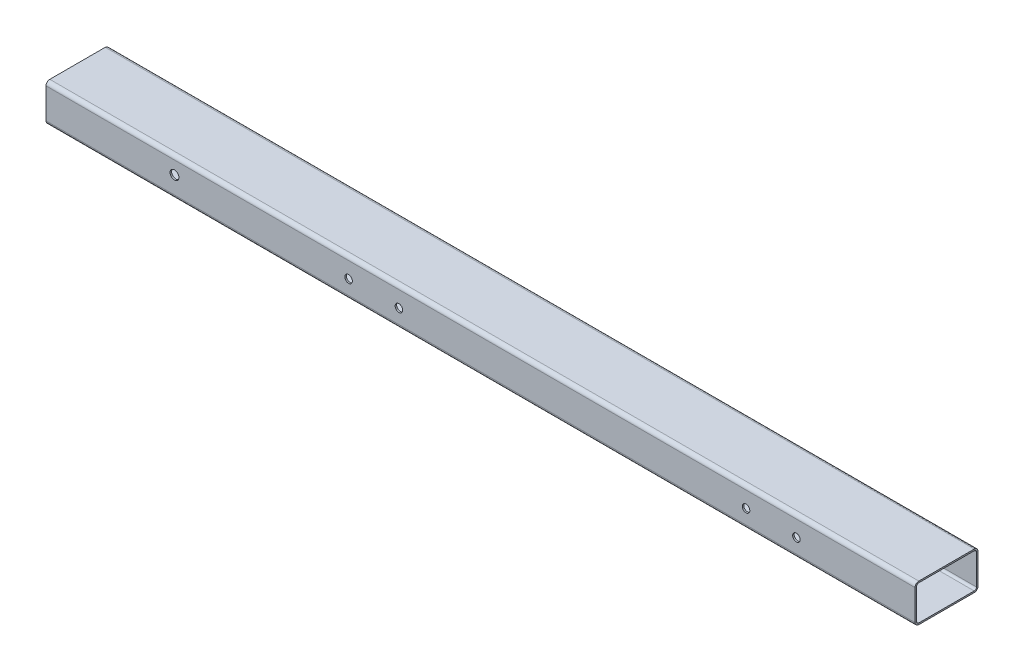
ISO-10303-21;
HEADER;
FILE_DESCRIPTION(('STEP AP214'),'2;1');
FILE_NAME('part.step','',(''),(''),'','','');
FILE_SCHEMA(('AUTOMOTIVE_DESIGN { 1 0 10303 214 1 1 1 1 }'));
ENDSEC;
DATA;
#1=APPLICATION_CONTEXT('core data for automotive mechanical design processes');
#2=APPLICATION_PROTOCOL_DEFINITION('international standard','automotive_design',2000,#1);
#3=PRODUCT_CONTEXT('',#1,'mechanical');
#4=PRODUCT('Part','Part','',(#3));
#5=PRODUCT_RELATED_PRODUCT_CATEGORY('part','',(#4));
#6=PRODUCT_DEFINITION_FORMATION('','',#4);
#7=PRODUCT_DEFINITION_CONTEXT('part definition',#1,'design');
#8=PRODUCT_DEFINITION('design','',#6,#7);
#9=PRODUCT_DEFINITION_SHAPE('','',#8);
#10=(LENGTH_UNIT() NAMED_UNIT(*) SI_UNIT(.MILLI.,.METRE.));
#11=(NAMED_UNIT(*) PLANE_ANGLE_UNIT() SI_UNIT($,.RADIAN.));
#12=(NAMED_UNIT(*) SI_UNIT($,.STERADIAN.) SOLID_ANGLE_UNIT());
#13=UNCERTAINTY_MEASURE_WITH_UNIT(LENGTH_MEASURE(1.E-05),#10,'distance_accuracy_value','');
#14=(GEOMETRIC_REPRESENTATION_CONTEXT(3) GLOBAL_UNCERTAINTY_ASSIGNED_CONTEXT((#13)) GLOBAL_UNIT_ASSIGNED_CONTEXT((#10,
#11,#12)) REPRESENTATION_CONTEXT('',''));
#15=CARTESIAN_POINT('',(0.,0.,0.));
#16=DIRECTION('',(0.,0.,1.));
#17=DIRECTION('',(1.,0.,0.));
#18=AXIS2_PLACEMENT_3D('',#15,#16,#17);
#19=CARTESIAN_POINT('',(689.8,12.,22.));
#20=DIRECTION('',(-1.,0.,0.));
#21=DIRECTION('',(0.,0.,1.));
#22=AXIS2_PLACEMENT_3D('',#19,#20,#21);
#23=CYLINDRICAL_SURFACE('',#22,3.);
#24=CARTESIAN_POINT('',(0.,12.,22.));
#25=DIRECTION('',(1.,0.,0.));
#26=DIRECTION('',(0.,0.,-1.));
#27=AXIS2_PLACEMENT_3D('',#24,#25,#26);
#28=CIRCLE('',#27,3.);
#29=CARTESIAN_POINT('',(0.,15.,22.));
#30=VERTEX_POINT('',#29);
#31=CARTESIAN_POINT('',(0.,12.,25.));
#32=VERTEX_POINT('',#31);
#33=EDGE_CURVE('E240',#30,#32,#28,.T.);
#34=ORIENTED_EDGE('',*,*,#33,.T.);
#35=DIRECTION('',(-1.,0.,0.));
#36=VECTOR('',#35,1.);
#37=CARTESIAN_POINT('',(689.8,12.,25.));
#38=LINE('',#37,#36);
#39=CARTESIAN_POINT('',(689.8,12.,25.));
#40=VERTEX_POINT('',#39);
#41=EDGE_CURVE('E12',#40,#32,#38,.T.);
#42=ORIENTED_EDGE('',*,*,#41,.F.);
#43=CARTESIAN_POINT('',(689.8,12.,22.));
#44=DIRECTION('',(1.,0.,0.));
#45=DIRECTION('',(0.,0.,-1.));
#46=AXIS2_PLACEMENT_3D('',#43,#44,#45);
#47=CIRCLE('',#46,3.);
#48=CARTESIAN_POINT('',(689.8,15.,22.));
#49=VERTEX_POINT('',#48);
#50=EDGE_CURVE('E328',#49,#40,#47,.T.);
#51=ORIENTED_EDGE('',*,*,#50,.F.);
#52=DIRECTION('',(-1.,0.,0.));
#53=VECTOR('',#52,1.);
#54=CARTESIAN_POINT('',(689.8,15.,22.));
#55=LINE('',#54,#53);
#56=EDGE_CURVE('E255',#49,#30,#55,.T.);
#57=ORIENTED_EDGE('',*,*,#56,.T.);
#58=EDGE_LOOP('',(#34,#42,#51,#57));
#59=FACE_BOUND('',#58,.T.);
#60=ADVANCED_FACE('F66',(#59),#23,.T.);
#61=CARTESIAN_POINT('',(689.8,12.,25.));
#62=DIRECTION('',(0.,0.,-1.));
#63=DIRECTION('',(-1.,0.,0.));
#64=AXIS2_PLACEMENT_3D('',#61,#62,#63);
#65=PLANE('',#64);
#66=CARTESIAN_POINT('',(102.,1.76941009464096,25.));
#67=DIRECTION('',(0.,0.,1.));
#68=DIRECTION('',(1.,0.,0.));
#69=AXIS2_PLACEMENT_3D('',#66,#67,#68);
#70=CIRCLE('',#69,3.50000000000001);
#71=CARTESIAN_POINT('',(105.5,1.76941009464096,25.));
#72=VERTEX_POINT('',#71);
#73=EDGE_CURVE('E471',#72,#72,#70,.T.);
#74=ORIENTED_EDGE('',*,*,#73,.F.);
#75=EDGE_LOOP('',(#74));
#76=FACE_BOUND('',#75,.T.);
#77=CARTESIAN_POINT('',(240.162500000002,-0.65302720036876,25.));
#78=DIRECTION('',(0.,0.,1.));
#79=DIRECTION('',(1.,0.,0.));
#80=AXIS2_PLACEMENT_3D('',#77,#78,#79);
#81=CIRCLE('',#80,2.99999999999999);
#82=CARTESIAN_POINT('',(243.162500000002,-0.65302720036876,25.));
#83=VERTEX_POINT('',#82);
#84=EDGE_CURVE('E484',#83,#83,#81,.T.);
#85=ORIENTED_EDGE('',*,*,#84,.F.);
#86=EDGE_LOOP('',(#85));
#87=FACE_BOUND('',#86,.T.);
#88=CARTESIAN_POINT('',(595.662500000002,-0.653027200368528,25.));
#89=DIRECTION('',(0.,0.,1.));
#90=DIRECTION('',(1.,0.,0.));
#91=AXIS2_PLACEMENT_3D('',#88,#89,#90);
#92=CIRCLE('',#91,3.00000000000005);
#93=CARTESIAN_POINT('',(598.662500000002,-0.653027200368528,25.));
#94=VERTEX_POINT('',#93);
#95=EDGE_CURVE('E491',#94,#94,#92,.T.);
#96=ORIENTED_EDGE('',*,*,#95,.F.);
#97=EDGE_LOOP('',(#96));
#98=FACE_BOUND('',#97,.T.);
#99=CARTESIAN_POINT('',(555.662500000002,-0.653027200368538,25.));
#100=DIRECTION('',(0.,0.,1.));
#101=DIRECTION('',(1.,0.,0.));
#102=AXIS2_PLACEMENT_3D('',#99,#100,#101);
#103=CIRCLE('',#102,3.00000000000005);
#104=CARTESIAN_POINT('',(558.662500000002,-0.653027200368538,25.));
#105=VERTEX_POINT('',#104);
#106=EDGE_CURVE('E478',#105,#105,#103,.T.);
#107=ORIENTED_EDGE('',*,*,#106,.F.);
#108=EDGE_LOOP('',(#107));
#109=FACE_BOUND('',#108,.T.);
#110=CARTESIAN_POINT('',(280.162500000002,-0.65302720036875,25.));
#111=DIRECTION('',(0.,0.,1.));
#112=DIRECTION('',(1.,0.,0.));
#113=AXIS2_PLACEMENT_3D('',#110,#111,#112);
#114=CIRCLE('',#113,2.99999999999999);
#115=CARTESIAN_POINT('',(283.162500000002,-0.65302720036875,25.));
#116=VERTEX_POINT('',#115);
#117=EDGE_CURVE('E487',#116,#116,#114,.T.);
#118=ORIENTED_EDGE('',*,*,#117,.F.);
#119=EDGE_LOOP('',(#118));
#120=FACE_BOUND('',#119,.T.);
#121=DIRECTION('',(0.,-1.,0.));
#122=VECTOR('',#121,1.);
#123=CARTESIAN_POINT('',(0.,12.,25.));
#124=LINE('',#123,#122);
#125=CARTESIAN_POINT('',(0.,-12.,25.));
#126=VERTEX_POINT('',#125);
#127=EDGE_CURVE('E243',#32,#126,#124,.T.);
#128=ORIENTED_EDGE('',*,*,#127,.T.);
#129=DIRECTION('',(-1.,0.,0.));
#130=VECTOR('',#129,1.);
#131=CARTESIAN_POINT('',(689.8,-12.,25.));
#132=LINE('',#131,#130);
#133=CARTESIAN_POINT('',(689.8,-12.,25.));
#134=VERTEX_POINT('',#133);
#135=EDGE_CURVE('E76',#134,#126,#132,.T.);
#136=ORIENTED_EDGE('',*,*,#135,.F.);
#137=DIRECTION('',(0.,-1.,0.));
#138=VECTOR('',#137,1.);
#139=CARTESIAN_POINT('',(689.8,12.,25.));
#140=LINE('',#139,#138);
#141=EDGE_CURVE('E330',#40,#134,#140,.T.);
#142=ORIENTED_EDGE('',*,*,#141,.F.);
#143=ORIENTED_EDGE('',*,*,#41,.T.);
#144=EDGE_LOOP('',(#128,#136,#142,#143));
#145=FACE_BOUND('',#144,.T.);
#146=ADVANCED_FACE('F368',(#76,#87,#98,#109,#120,#145),#65,.F.);
#147=CARTESIAN_POINT('',(689.8,-12.,22.));
#148=DIRECTION('',(-1.,0.,0.));
#149=DIRECTION('',(0.,0.,1.));
#150=AXIS2_PLACEMENT_3D('',#147,#148,#149);
#151=CYLINDRICAL_SURFACE('',#150,3.);
#152=CARTESIAN_POINT('',(0.,-12.,22.));
#153=DIRECTION('',(1.,0.,0.));
#154=DIRECTION('',(0.,0.,-1.));
#155=AXIS2_PLACEMENT_3D('',#152,#153,#154);
#156=CIRCLE('',#155,3.);
#157=CARTESIAN_POINT('',(0.,-15.,22.));
#158=VERTEX_POINT('',#157);
#159=EDGE_CURVE('E245',#126,#158,#156,.T.);
#160=ORIENTED_EDGE('',*,*,#159,.T.);
#161=DIRECTION('',(-1.,0.,0.));
#162=VECTOR('',#161,1.);
#163=CARTESIAN_POINT('',(689.8,-15.,22.));
#164=LINE('',#163,#162);
#165=CARTESIAN_POINT('',(689.8,-15.,22.));
#166=VERTEX_POINT('',#165);
#167=EDGE_CURVE('E262',#166,#158,#164,.T.);
#168=ORIENTED_EDGE('',*,*,#167,.F.);
#169=CARTESIAN_POINT('',(689.8,-12.,22.));
#170=DIRECTION('',(1.,0.,0.));
#171=DIRECTION('',(0.,0.,-1.));
#172=AXIS2_PLACEMENT_3D('',#169,#170,#171);
#173=CIRCLE('',#172,3.);
#174=EDGE_CURVE('E332',#134,#166,#173,.T.);
#175=ORIENTED_EDGE('',*,*,#174,.F.);
#176=ORIENTED_EDGE('',*,*,#135,.T.);
#177=EDGE_LOOP('',(#160,#168,#175,#176));
#178=FACE_BOUND('',#177,.T.);
#179=ADVANCED_FACE('F373',(#178),#151,.T.);
#180=CARTESIAN_POINT('',(689.8,-15.,-22.));
#181=DIRECTION('',(0.,1.,0.));
#182=DIRECTION('',(0.,0.,1.));
#183=AXIS2_PLACEMENT_3D('',#180,#181,#182);
#184=PLANE('',#183);
#185=DIRECTION('',(0.,0.,-1.));
#186=VECTOR('',#185,1.);
#187=CARTESIAN_POINT('',(0.,-15.,-22.));
#188=LINE('',#187,#186);
#189=CARTESIAN_POINT('',(0.,-15.,-22.));
#190=VERTEX_POINT('',#189);
#191=EDGE_CURVE('E247',#158,#190,#188,.T.);
#192=ORIENTED_EDGE('',*,*,#191,.T.);
#193=DIRECTION('',(-1.,0.,0.));
#194=VECTOR('',#193,1.);
#195=CARTESIAN_POINT('',(689.8,-15.,-22.));
#196=LINE('',#195,#194);
#197=CARTESIAN_POINT('',(689.8,-15.,-22.));
#198=VERTEX_POINT('',#197);
#199=EDGE_CURVE('E259',#198,#190,#196,.T.);
#200=ORIENTED_EDGE('',*,*,#199,.F.);
#201=DIRECTION('',(0.,0.,-1.));
#202=VECTOR('',#201,1.);
#203=CARTESIAN_POINT('',(689.8,-15.,-22.));
#204=LINE('',#203,#202);
#205=EDGE_CURVE('E334',#166,#198,#204,.T.);
#206=ORIENTED_EDGE('',*,*,#205,.F.);
#207=ORIENTED_EDGE('',*,*,#167,.T.);
#208=EDGE_LOOP('',(#192,#200,#206,#207));
#209=FACE_BOUND('',#208,.T.);
#210=ADVANCED_FACE('F340',(#209),#184,.F.);
#211=CARTESIAN_POINT('',(689.8,-12.,-22.));
#212=DIRECTION('',(-1.,0.,0.));
#213=DIRECTION('',(0.,0.,1.));
#214=AXIS2_PLACEMENT_3D('',#211,#212,#213);
#215=CYLINDRICAL_SURFACE('',#214,3.);
#216=CARTESIAN_POINT('',(0.,-12.,-22.));
#217=DIRECTION('',(1.,0.,0.));
#218=DIRECTION('',(0.,0.,-1.));
#219=AXIS2_PLACEMENT_3D('',#216,#217,#218);
#220=CIRCLE('',#219,3.);
#221=CARTESIAN_POINT('',(0.,-12.,-25.));
#222=VERTEX_POINT('',#221);
#223=EDGE_CURVE('E249',#190,#222,#220,.T.);
#224=ORIENTED_EDGE('',*,*,#223,.T.);
#225=DIRECTION('',(-1.,0.,0.));
#226=VECTOR('',#225,1.);
#227=CARTESIAN_POINT('',(689.8,-12.,-25.));
#228=LINE('',#227,#226);
#229=CARTESIAN_POINT('',(689.8,-12.,-25.));
#230=VERTEX_POINT('',#229);
#231=EDGE_CURVE('E206',#230,#222,#228,.T.);
#232=ORIENTED_EDGE('',*,*,#231,.F.);
#233=CARTESIAN_POINT('',(689.8,-12.,-22.));
#234=DIRECTION('',(1.,0.,0.));
#235=DIRECTION('',(0.,0.,-1.));
#236=AXIS2_PLACEMENT_3D('',#233,#234,#235);
#237=CIRCLE('',#236,3.);
#238=EDGE_CURVE('E197',#198,#230,#237,.T.);
#239=ORIENTED_EDGE('',*,*,#238,.F.);
#240=ORIENTED_EDGE('',*,*,#199,.T.);
#241=EDGE_LOOP('',(#224,#232,#239,#240));
#242=FACE_BOUND('',#241,.T.);
#243=ADVANCED_FACE('F344',(#242),#215,.T.);
#244=CARTESIAN_POINT('',(689.8,-12.,-25.));
#245=DIRECTION('',(0.,0.,1.));
#246=DIRECTION('',(1.,0.,0.));
#247=AXIS2_PLACEMENT_3D('',#244,#245,#246);
#248=PLANE('',#247);
#249=CARTESIAN_POINT('',(102.,1.76941009464096,-25.));
#250=DIRECTION('',(0.,0.,1.));
#251=DIRECTION('',(1.,0.,0.));
#252=AXIS2_PLACEMENT_3D('',#249,#250,#251);
#253=CIRCLE('',#252,3.50000000000001);
#254=CARTESIAN_POINT('',(105.5,1.76941009464096,-25.));
#255=VERTEX_POINT('',#254);
#256=EDGE_CURVE('E469',#255,#255,#253,.T.);
#257=ORIENTED_EDGE('',*,*,#256,.T.);
#258=EDGE_LOOP('',(#257));
#259=FACE_BOUND('',#258,.T.);
#260=CARTESIAN_POINT('',(240.162500000002,-0.65302720036876,-25.));
#261=DIRECTION('',(0.,0.,1.));
#262=DIRECTION('',(1.,0.,0.));
#263=AXIS2_PLACEMENT_3D('',#260,#261,#262);
#264=CIRCLE('',#263,2.99999999999999);
#265=CARTESIAN_POINT('',(243.162500000002,-0.65302720036876,-25.));
#266=VERTEX_POINT('',#265);
#267=EDGE_CURVE('E488',#266,#266,#264,.T.);
#268=ORIENTED_EDGE('',*,*,#267,.T.);
#269=EDGE_LOOP('',(#268));
#270=FACE_BOUND('',#269,.T.);
#271=CARTESIAN_POINT('',(595.662500000002,-0.653027200368528,-25.));
#272=DIRECTION('',(0.,0.,1.));
#273=DIRECTION('',(1.,0.,0.));
#274=AXIS2_PLACEMENT_3D('',#271,#272,#273);
#275=CIRCLE('',#274,3.00000000000005);
#276=CARTESIAN_POINT('',(598.662500000002,-0.653027200368528,-25.));
#277=VERTEX_POINT('',#276);
#278=EDGE_CURVE('E481',#277,#277,#275,.T.);
#279=ORIENTED_EDGE('',*,*,#278,.T.);
#280=EDGE_LOOP('',(#279));
#281=FACE_BOUND('',#280,.T.);
#282=CARTESIAN_POINT('',(555.662500000002,-0.653027200368538,-25.));
#283=DIRECTION('',(0.,0.,1.));
#284=DIRECTION('',(1.,0.,0.));
#285=AXIS2_PLACEMENT_3D('',#282,#283,#284);
#286=CIRCLE('',#285,3.00000000000005);
#287=CARTESIAN_POINT('',(558.662500000002,-0.653027200368538,-25.));
#288=VERTEX_POINT('',#287);
#289=EDGE_CURVE('E477',#288,#288,#286,.T.);
#290=ORIENTED_EDGE('',*,*,#289,.T.);
#291=EDGE_LOOP('',(#290));
#292=FACE_BOUND('',#291,.T.);
#293=CARTESIAN_POINT('',(280.162500000002,-0.65302720036875,-25.));
#294=DIRECTION('',(0.,0.,1.));
#295=DIRECTION('',(1.,0.,0.));
#296=AXIS2_PLACEMENT_3D('',#293,#294,#295);
#297=CIRCLE('',#296,2.99999999999999);
#298=CARTESIAN_POINT('',(283.162500000002,-0.65302720036875,-25.));
#299=VERTEX_POINT('',#298);
#300=EDGE_CURVE('E285',#299,#299,#297,.T.);
#301=ORIENTED_EDGE('',*,*,#300,.T.);
#302=EDGE_LOOP('',(#301));
#303=FACE_BOUND('',#302,.T.);
#304=DIRECTION('',(0.,1.,0.));
#305=VECTOR('',#304,1.);
#306=CARTESIAN_POINT('',(0.,-12.,-25.));
#307=LINE('',#306,#305);
#308=CARTESIAN_POINT('',(0.,12.,-25.));
#309=VERTEX_POINT('',#308);
#310=EDGE_CURVE('E205',#222,#309,#307,.T.);
#311=ORIENTED_EDGE('',*,*,#310,.T.);
#312=DIRECTION('',(-1.,0.,0.));
#313=VECTOR('',#312,1.);
#314=CARTESIAN_POINT('',(689.8,12.,-25.));
#315=LINE('',#314,#313);
#316=CARTESIAN_POINT('',(689.8,12.,-25.));
#317=VERTEX_POINT('',#316);
#318=EDGE_CURVE('E202',#317,#309,#315,.T.);
#319=ORIENTED_EDGE('',*,*,#318,.F.);
#320=DIRECTION('',(0.,1.,0.));
#321=VECTOR('',#320,1.);
#322=CARTESIAN_POINT('',(689.8,-12.,-25.));
#323=LINE('',#322,#321);
#324=EDGE_CURVE('E191',#230,#317,#323,.T.);
#325=ORIENTED_EDGE('',*,*,#324,.F.);
#326=ORIENTED_EDGE('',*,*,#231,.T.);
#327=EDGE_LOOP('',(#311,#319,#325,#326));
#328=FACE_BOUND('',#327,.T.);
#329=ADVANCED_FACE('F203',(#259,#270,#281,#292,#303,#328),#248,.F.);
#330=CARTESIAN_POINT('',(689.8,12.,-22.));
#331=DIRECTION('',(-1.,0.,0.));
#332=DIRECTION('',(0.,0.,1.));
#333=AXIS2_PLACEMENT_3D('',#330,#331,#332);
#334=CYLINDRICAL_SURFACE('',#333,3.);
#335=CARTESIAN_POINT('',(0.,12.,-22.));
#336=DIRECTION('',(1.,0.,0.));
#337=DIRECTION('',(0.,0.,-1.));
#338=AXIS2_PLACEMENT_3D('',#335,#336,#337);
#339=CIRCLE('',#338,3.);
#340=CARTESIAN_POINT('',(0.,15.,-22.));
#341=VERTEX_POINT('',#340);
#342=EDGE_CURVE('E138',#309,#341,#339,.T.);
#343=ORIENTED_EDGE('',*,*,#342,.T.);
#344=DIRECTION('',(-1.,0.,0.));
#345=VECTOR('',#344,1.);
#346=CARTESIAN_POINT('',(689.8,15.,-22.));
#347=LINE('',#346,#345);
#348=CARTESIAN_POINT('',(689.8,15.,-22.));
#349=VERTEX_POINT('',#348);
#350=EDGE_CURVE('E207',#349,#341,#347,.T.);
#351=ORIENTED_EDGE('',*,*,#350,.F.);
#352=CARTESIAN_POINT('',(689.8,12.,-22.));
#353=DIRECTION('',(1.,0.,0.));
#354=DIRECTION('',(0.,0.,-1.));
#355=AXIS2_PLACEMENT_3D('',#352,#353,#354);
#356=CIRCLE('',#355,3.);
#357=EDGE_CURVE('E195',#317,#349,#356,.T.);
#358=ORIENTED_EDGE('',*,*,#357,.F.);
#359=ORIENTED_EDGE('',*,*,#318,.T.);
#360=EDGE_LOOP('',(#343,#351,#358,#359));
#361=FACE_BOUND('',#360,.T.);
#362=ADVANCED_FACE('F209',(#361),#334,.T.);
#363=CARTESIAN_POINT('',(689.8,-12.,22.));
#364=DIRECTION('',(-1.,0.,0.));
#365=DIRECTION('',(0.,0.,1.));
#366=AXIS2_PLACEMENT_3D('',#363,#364,#365);
#367=CYLINDRICAL_SURFACE('',#366,1.8);
#368=CARTESIAN_POINT('',(0.,-12.,22.));
#369=DIRECTION('',(1.,0.,0.));
#370=DIRECTION('',(0.,0.,-1.));
#371=AXIS2_PLACEMENT_3D('',#368,#369,#370);
#372=CIRCLE('',#371,1.8);
#373=CARTESIAN_POINT('',(0.,-12.,23.8));
#374=VERTEX_POINT('',#373);
#375=CARTESIAN_POINT('',(0.,-13.8,22.));
#376=VERTEX_POINT('',#375);
#377=EDGE_CURVE('E215',#374,#376,#372,.T.);
#378=ORIENTED_EDGE('',*,*,#377,.F.);
#379=DIRECTION('',(-1.,0.,0.));
#380=VECTOR('',#379,1.);
#381=CARTESIAN_POINT('',(689.8,-12.,23.8));
#382=LINE('',#381,#380);
#383=CARTESIAN_POINT('',(689.8,-12.,23.8));
#384=VERTEX_POINT('',#383);
#385=EDGE_CURVE('E152',#384,#374,#382,.T.);
#386=ORIENTED_EDGE('',*,*,#385,.F.);
#387=CARTESIAN_POINT('',(689.8,-12.,22.));
#388=DIRECTION('',(1.,0.,0.));
#389=DIRECTION('',(0.,0.,-1.));
#390=AXIS2_PLACEMENT_3D('',#387,#388,#389);
#391=CIRCLE('',#390,1.8);
#392=CARTESIAN_POINT('',(689.8,-13.8,22.));
#393=VERTEX_POINT('',#392);
#394=EDGE_CURVE('E254',#384,#393,#391,.T.);
#395=ORIENTED_EDGE('',*,*,#394,.T.);
#396=DIRECTION('',(-1.,0.,0.));
#397=VECTOR('',#396,1.);
#398=CARTESIAN_POINT('',(689.8,-13.8,22.));
#399=LINE('',#398,#397);
#400=EDGE_CURVE('E211',#393,#376,#399,.T.);
#401=ORIENTED_EDGE('',*,*,#400,.T.);
#402=EDGE_LOOP('',(#378,#386,#395,#401));
#403=FACE_BOUND('',#402,.T.);
#404=ADVANCED_FACE('F68',(#403),#367,.F.);
#405=CARTESIAN_POINT('',(689.8,12.,23.8));
#406=DIRECTION('',(0.,0.,-1.));
#407=DIRECTION('',(-1.,0.,0.));
#408=AXIS2_PLACEMENT_3D('',#405,#406,#407);
#409=PLANE('',#408);
#410=CARTESIAN_POINT('',(102.,1.76941009464096,23.8));
#411=DIRECTION('',(0.,0.,-1.));
#412=DIRECTION('',(-1.,0.,0.));
#413=AXIS2_PLACEMENT_3D('',#410,#411,#412);
#414=CIRCLE('',#413,3.50000000000001);
#415=CARTESIAN_POINT('',(98.4999999999999,1.76941009464096,23.8));
#416=VERTEX_POINT('',#415);
#417=EDGE_CURVE('E405',#416,#416,#414,.T.);
#418=ORIENTED_EDGE('',*,*,#417,.F.);
#419=EDGE_LOOP('',(#418));
#420=FACE_BOUND('',#419,.T.);
#421=CARTESIAN_POINT('',(240.162500000002,-0.65302720036876,23.8));
#422=DIRECTION('',(0.,0.,-1.));
#423=DIRECTION('',(-1.,0.,0.));
#424=AXIS2_PLACEMENT_3D('',#421,#422,#423);
#425=CIRCLE('',#424,2.99999999999999);
#426=CARTESIAN_POINT('',(237.162500000002,-0.65302720036876,23.8));
#427=VERTEX_POINT('',#426);
#428=EDGE_CURVE('E219',#427,#427,#425,.T.);
#429=ORIENTED_EDGE('',*,*,#428,.F.);
#430=EDGE_LOOP('',(#429));
#431=FACE_BOUND('',#430,.T.);
#432=CARTESIAN_POINT('',(595.662500000002,-0.653027200368528,23.8));
#433=DIRECTION('',(0.,0.,-1.));
#434=DIRECTION('',(-1.,0.,0.));
#435=AXIS2_PLACEMENT_3D('',#432,#433,#434);
#436=CIRCLE('',#435,3.00000000000005);
#437=CARTESIAN_POINT('',(592.662500000002,-0.653027200368528,23.8));
#438=VERTEX_POINT('',#437);
#439=EDGE_CURVE('E292',#438,#438,#436,.T.);
#440=ORIENTED_EDGE('',*,*,#439,.F.);
#441=EDGE_LOOP('',(#440));
#442=FACE_BOUND('',#441,.T.);
#443=CARTESIAN_POINT('',(555.662500000002,-0.653027200368538,23.8));
#444=DIRECTION('',(0.,0.,-1.));
#445=DIRECTION('',(-1.,0.,0.));
#446=AXIS2_PLACEMENT_3D('',#443,#444,#445);
#447=CIRCLE('',#446,3.00000000000005);
#448=CARTESIAN_POINT('',(552.662500000002,-0.653027200368538,23.8));
#449=VERTEX_POINT('',#448);
#450=EDGE_CURVE('E289',#449,#449,#447,.T.);
#451=ORIENTED_EDGE('',*,*,#450,.F.);
#452=EDGE_LOOP('',(#451));
#453=FACE_BOUND('',#452,.T.);
#454=CARTESIAN_POINT('',(280.162500000002,-0.65302720036875,23.8));
#455=DIRECTION('',(0.,0.,-1.));
#456=DIRECTION('',(-1.,0.,0.));
#457=AXIS2_PLACEMENT_3D('',#454,#455,#456);
#458=CIRCLE('',#457,2.99999999999999);
#459=CARTESIAN_POINT('',(277.162500000002,-0.65302720036875,23.8));
#460=VERTEX_POINT('',#459);
#461=EDGE_CURVE('E284',#460,#460,#458,.T.);
#462=ORIENTED_EDGE('',*,*,#461,.F.);
#463=EDGE_LOOP('',(#462));
#464=FACE_BOUND('',#463,.T.);
#465=DIRECTION('',(0.,-1.,0.));
#466=VECTOR('',#465,1.);
#467=CARTESIAN_POINT('',(0.,12.,23.8));
#468=LINE('',#467,#466);
#469=CARTESIAN_POINT('',(0.,12.,23.8));
#470=VERTEX_POINT('',#469);
#471=EDGE_CURVE('E218',#470,#374,#468,.T.);
#472=ORIENTED_EDGE('',*,*,#471,.F.);
#473=DIRECTION('',(-1.,0.,0.));
#474=VECTOR('',#473,1.);
#475=CARTESIAN_POINT('',(689.8,12.,23.8));
#476=LINE('',#475,#474);
#477=CARTESIAN_POINT('',(689.8,12.,23.8));
#478=VERTEX_POINT('',#477);
#479=EDGE_CURVE('E278',#478,#470,#476,.T.);
#480=ORIENTED_EDGE('',*,*,#479,.F.);
#481=DIRECTION('',(0.,-1.,0.));
#482=VECTOR('',#481,1.);
#483=CARTESIAN_POINT('',(689.8,12.,23.8));
#484=LINE('',#483,#482);
#485=EDGE_CURVE('E307',#478,#384,#484,.T.);
#486=ORIENTED_EDGE('',*,*,#485,.T.);
#487=ORIENTED_EDGE('',*,*,#385,.T.);
#488=EDGE_LOOP('',(#472,#480,#486,#487));
#489=FACE_BOUND('',#488,.T.);
#490=ADVANCED_FACE('F395',(#420,#431,#442,#453,#464,#489),#409,.T.);
#491=CARTESIAN_POINT('',(689.8,12.,22.));
#492=DIRECTION('',(-1.,0.,0.));
#493=DIRECTION('',(0.,0.,1.));
#494=AXIS2_PLACEMENT_3D('',#491,#492,#493);
#495=CYLINDRICAL_SURFACE('',#494,1.8);
#496=CARTESIAN_POINT('',(0.,12.,22.));
#497=DIRECTION('',(1.,0.,0.));
#498=DIRECTION('',(0.,0.,-1.));
#499=AXIS2_PLACEMENT_3D('',#496,#497,#498);
#500=CIRCLE('',#499,1.8);
#501=CARTESIAN_POINT('',(0.,13.8,22.));
#502=VERTEX_POINT('',#501);
#503=EDGE_CURVE('E222',#502,#470,#500,.T.);
#504=ORIENTED_EDGE('',*,*,#503,.F.);
#505=DIRECTION('',(-1.,0.,0.));
#506=VECTOR('',#505,1.);
#507=CARTESIAN_POINT('',(689.8,13.8,22.));
#508=LINE('',#507,#506);
#509=CARTESIAN_POINT('',(689.8,13.8,22.));
#510=VERTEX_POINT('',#509);
#511=EDGE_CURVE('E276',#510,#502,#508,.T.);
#512=ORIENTED_EDGE('',*,*,#511,.F.);
#513=CARTESIAN_POINT('',(689.8,12.,22.));
#514=DIRECTION('',(1.,0.,0.));
#515=DIRECTION('',(0.,0.,-1.));
#516=AXIS2_PLACEMENT_3D('',#513,#514,#515);
#517=CIRCLE('',#516,1.8);
#518=EDGE_CURVE('E310',#510,#478,#517,.T.);
#519=ORIENTED_EDGE('',*,*,#518,.T.);
#520=ORIENTED_EDGE('',*,*,#479,.T.);
#521=EDGE_LOOP('',(#504,#512,#519,#520));
#522=FACE_BOUND('',#521,.T.);
#523=ADVANCED_FACE('F392',(#522),#495,.F.);
#524=CARTESIAN_POINT('',(689.8,13.8,22.));
#525=DIRECTION('',(0.,-1.,0.));
#526=DIRECTION('',(0.,0.,-1.));
#527=AXIS2_PLACEMENT_3D('',#524,#525,#526);
#528=PLANE('',#527);
#529=DIRECTION('',(0.,0.,1.));
#530=VECTOR('',#529,1.);
#531=CARTESIAN_POINT('',(0.,13.8,22.));
#532=LINE('',#531,#530);
#533=CARTESIAN_POINT('',(0.,13.8,-22.));
#534=VERTEX_POINT('',#533);
#535=EDGE_CURVE('E225',#534,#502,#532,.T.);
#536=ORIENTED_EDGE('',*,*,#535,.F.);
#537=DIRECTION('',(-1.,0.,0.));
#538=VECTOR('',#537,1.);
#539=CARTESIAN_POINT('',(689.8,13.8,-22.));
#540=LINE('',#539,#538);
#541=CARTESIAN_POINT('',(689.8,13.8,-22.));
#542=VERTEX_POINT('',#541);
#543=EDGE_CURVE('E274',#542,#534,#540,.T.);
#544=ORIENTED_EDGE('',*,*,#543,.F.);
#545=DIRECTION('',(0.,0.,1.));
#546=VECTOR('',#545,1.);
#547=CARTESIAN_POINT('',(689.8,13.8,22.));
#548=LINE('',#547,#546);
#549=EDGE_CURVE('E313',#542,#510,#548,.T.);
#550=ORIENTED_EDGE('',*,*,#549,.T.);
#551=ORIENTED_EDGE('',*,*,#511,.T.);
#552=EDGE_LOOP('',(#536,#544,#550,#551));
#553=FACE_BOUND('',#552,.T.);
#554=ADVANCED_FACE('F388',(#553),#528,.T.);
#555=CARTESIAN_POINT('',(689.8,12.,-22.));
#556=DIRECTION('',(-1.,0.,0.));
#557=DIRECTION('',(0.,0.,1.));
#558=AXIS2_PLACEMENT_3D('',#555,#556,#557);
#559=CYLINDRICAL_SURFACE('',#558,1.8);
#560=CARTESIAN_POINT('',(0.,12.,-22.));
#561=DIRECTION('',(1.,0.,0.));
#562=DIRECTION('',(0.,0.,-1.));
#563=AXIS2_PLACEMENT_3D('',#560,#561,#562);
#564=CIRCLE('',#563,1.8);
#565=CARTESIAN_POINT('',(0.,12.,-23.8));
#566=VERTEX_POINT('',#565);
#567=EDGE_CURVE('E228',#566,#534,#564,.T.);
#568=ORIENTED_EDGE('',*,*,#567,.F.);
#569=DIRECTION('',(-1.,0.,0.));
#570=VECTOR('',#569,1.);
#571=CARTESIAN_POINT('',(689.8,12.,-23.8));
#572=LINE('',#571,#570);
#573=CARTESIAN_POINT('',(689.8,12.,-23.8));
#574=VERTEX_POINT('',#573);
#575=EDGE_CURVE('E272',#574,#566,#572,.T.);
#576=ORIENTED_EDGE('',*,*,#575,.F.);
#577=CARTESIAN_POINT('',(689.8,12.,-22.));
#578=DIRECTION('',(1.,0.,0.));
#579=DIRECTION('',(0.,0.,-1.));
#580=AXIS2_PLACEMENT_3D('',#577,#578,#579);
#581=CIRCLE('',#580,1.8);
#582=EDGE_CURVE('E316',#574,#542,#581,.T.);
#583=ORIENTED_EDGE('',*,*,#582,.T.);
#584=ORIENTED_EDGE('',*,*,#543,.T.);
#585=EDGE_LOOP('',(#568,#576,#583,#584));
#586=FACE_BOUND('',#585,.T.);
#587=ADVANCED_FACE('F384',(#586),#559,.F.);
#588=CARTESIAN_POINT('',(689.8,-12.,-23.8));
#589=DIRECTION('',(0.,0.,1.));
#590=DIRECTION('',(1.,0.,0.));
#591=AXIS2_PLACEMENT_3D('',#588,#589,#590);
#592=PLANE('',#591);
#593=CARTESIAN_POINT('',(102.,1.76941009464096,-23.8));
#594=DIRECTION('',(0.,0.,1.));
#595=DIRECTION('',(1.,0.,0.));
#596=AXIS2_PLACEMENT_3D('',#593,#594,#595);
#597=CIRCLE('',#596,3.50000000000001);
#598=CARTESIAN_POINT('',(105.5,1.76941009464096,-23.8));
#599=VERTEX_POINT('',#598);
#600=EDGE_CURVE('E70',#599,#599,#597,.T.);
#601=ORIENTED_EDGE('',*,*,#600,.F.);
#602=EDGE_LOOP('',(#601));
#603=FACE_BOUND('',#602,.T.);
#604=CARTESIAN_POINT('',(240.162500000002,-0.65302720036876,-23.8));
#605=DIRECTION('',(0.,0.,1.));
#606=DIRECTION('',(1.,0.,0.));
#607=AXIS2_PLACEMENT_3D('',#604,#605,#606);
#608=CIRCLE('',#607,2.99999999999999);
#609=CARTESIAN_POINT('',(243.162500000002,-0.65302720036876,-23.8));
#610=VERTEX_POINT('',#609);
#611=EDGE_CURVE('E293',#610,#610,#608,.T.);
#612=ORIENTED_EDGE('',*,*,#611,.F.);
#613=EDGE_LOOP('',(#612));
#614=FACE_BOUND('',#613,.T.);
#615=CARTESIAN_POINT('',(595.662500000002,-0.653027200368528,-23.8));
#616=DIRECTION('',(0.,0.,1.));
#617=DIRECTION('',(1.,0.,0.));
#618=AXIS2_PLACEMENT_3D('',#615,#616,#617);
#619=CIRCLE('',#618,3.00000000000005);
#620=CARTESIAN_POINT('',(598.662500000002,-0.653027200368528,-23.8));
#621=VERTEX_POINT('',#620);
#622=EDGE_CURVE('E290',#621,#621,#619,.T.);
#623=ORIENTED_EDGE('',*,*,#622,.F.);
#624=EDGE_LOOP('',(#623));
#625=FACE_BOUND('',#624,.T.);
#626=CARTESIAN_POINT('',(555.662500000002,-0.653027200368538,-23.8));
#627=DIRECTION('',(0.,0.,1.));
#628=DIRECTION('',(1.,0.,0.));
#629=AXIS2_PLACEMENT_3D('',#626,#627,#628);
#630=CIRCLE('',#629,3.00000000000005);
#631=CARTESIAN_POINT('',(558.662500000002,-0.653027200368538,-23.8));
#632=VERTEX_POINT('',#631);
#633=EDGE_CURVE('E286',#632,#632,#630,.T.);
#634=ORIENTED_EDGE('',*,*,#633,.F.);
#635=EDGE_LOOP('',(#634));
#636=FACE_BOUND('',#635,.T.);
#637=CARTESIAN_POINT('',(280.162500000002,-0.65302720036875,-23.8));
#638=DIRECTION('',(0.,0.,1.));
#639=DIRECTION('',(1.,0.,0.));
#640=AXIS2_PLACEMENT_3D('',#637,#638,#639);
#641=CIRCLE('',#640,2.99999999999999);
#642=CARTESIAN_POINT('',(283.162500000002,-0.65302720036875,-23.8));
#643=VERTEX_POINT('',#642);
#644=EDGE_CURVE('E281',#643,#643,#641,.T.);
#645=ORIENTED_EDGE('',*,*,#644,.F.);
#646=EDGE_LOOP('',(#645));
#647=FACE_BOUND('',#646,.T.);
#648=DIRECTION('',(0.,1.,0.));
#649=VECTOR('',#648,1.);
#650=CARTESIAN_POINT('',(0.,-12.,-23.8));
#651=LINE('',#650,#649);
#652=CARTESIAN_POINT('',(0.,-12.,-23.8));
#653=VERTEX_POINT('',#652);
#654=EDGE_CURVE('E231',#653,#566,#651,.T.);
#655=ORIENTED_EDGE('',*,*,#654,.F.);
#656=DIRECTION('',(-1.,0.,0.));
#657=VECTOR('',#656,1.);
#658=CARTESIAN_POINT('',(689.8,-12.,-23.8));
#659=LINE('',#658,#657);
#660=CARTESIAN_POINT('',(689.8,-12.,-23.8));
#661=VERTEX_POINT('',#660);
#662=EDGE_CURVE('E270',#661,#653,#659,.T.);
#663=ORIENTED_EDGE('',*,*,#662,.F.);
#664=DIRECTION('',(0.,1.,0.));
#665=VECTOR('',#664,1.);
#666=CARTESIAN_POINT('',(689.8,-12.,-23.8));
#667=LINE('',#666,#665);
#668=EDGE_CURVE('E319',#661,#574,#667,.T.);
#669=ORIENTED_EDGE('',*,*,#668,.T.);
#670=ORIENTED_EDGE('',*,*,#575,.T.);
#671=EDGE_LOOP('',(#655,#663,#669,#670));
#672=FACE_BOUND('',#671,.T.);
#673=ADVANCED_FACE('F380',(#603,#614,#625,#636,#647,#672),#592,.T.);
#674=CARTESIAN_POINT('',(689.8,-12.,-22.));
#675=DIRECTION('',(-1.,0.,0.));
#676=DIRECTION('',(0.,0.,1.));
#677=AXIS2_PLACEMENT_3D('',#674,#675,#676);
#678=CYLINDRICAL_SURFACE('',#677,1.8);
#679=CARTESIAN_POINT('',(0.,-12.,-22.));
#680=DIRECTION('',(1.,0.,0.));
#681=DIRECTION('',(0.,0.,-1.));
#682=AXIS2_PLACEMENT_3D('',#679,#680,#681);
#683=CIRCLE('',#682,1.8);
#684=CARTESIAN_POINT('',(0.,-13.8,-22.));
#685=VERTEX_POINT('',#684);
#686=EDGE_CURVE('E234',#685,#653,#683,.T.);
#687=ORIENTED_EDGE('',*,*,#686,.F.);
#688=DIRECTION('',(-1.,0.,0.));
#689=VECTOR('',#688,1.);
#690=CARTESIAN_POINT('',(689.8,-13.8,-22.));
#691=LINE('',#690,#689);
#692=CARTESIAN_POINT('',(689.8,-13.8,-22.));
#693=VERTEX_POINT('',#692);
#694=EDGE_CURVE('E268',#693,#685,#691,.T.);
#695=ORIENTED_EDGE('',*,*,#694,.F.);
#696=CARTESIAN_POINT('',(689.8,-12.,-22.));
#697=DIRECTION('',(1.,0.,0.));
#698=DIRECTION('',(0.,0.,-1.));
#699=AXIS2_PLACEMENT_3D('',#696,#697,#698);
#700=CIRCLE('',#699,1.8);
#701=EDGE_CURVE('E322',#693,#661,#700,.T.);
#702=ORIENTED_EDGE('',*,*,#701,.T.);
#703=ORIENTED_EDGE('',*,*,#662,.T.);
#704=EDGE_LOOP('',(#687,#695,#702,#703));
#705=FACE_BOUND('',#704,.T.);
#706=ADVANCED_FACE('F362',(#705),#678,.F.);
#707=CARTESIAN_POINT('',(689.8,-13.8,-22.));
#708=DIRECTION('',(0.,1.,0.));
#709=DIRECTION('',(0.,0.,1.));
#710=AXIS2_PLACEMENT_3D('',#707,#708,#709);
#711=PLANE('',#710);
#712=DIRECTION('',(0.,0.,-1.));
#713=VECTOR('',#712,1.);
#714=CARTESIAN_POINT('',(0.,-13.8,-22.));
#715=LINE('',#714,#713);
#716=EDGE_CURVE('E237',#376,#685,#715,.T.);
#717=ORIENTED_EDGE('',*,*,#716,.F.);
#718=ORIENTED_EDGE('',*,*,#400,.F.);
#719=DIRECTION('',(0.,0.,-1.));
#720=VECTOR('',#719,1.);
#721=CARTESIAN_POINT('',(689.8,-13.8,-22.));
#722=LINE('',#721,#720);
#723=EDGE_CURVE('E325',#393,#693,#722,.T.);
#724=ORIENTED_EDGE('',*,*,#723,.T.);
#725=ORIENTED_EDGE('',*,*,#694,.T.);
#726=EDGE_LOOP('',(#717,#718,#724,#725));
#727=FACE_BOUND('',#726,.T.);
#728=ADVANCED_FACE('F354',(#727),#711,.T.);
#729=CARTESIAN_POINT('',(689.8,15.,22.));
#730=DIRECTION('',(0.,-1.,0.));
#731=DIRECTION('',(0.,0.,-1.));
#732=AXIS2_PLACEMENT_3D('',#729,#730,#731);
#733=PLANE('',#732);
#734=DIRECTION('',(0.,0.,1.));
#735=VECTOR('',#734,1.);
#736=CARTESIAN_POINT('',(0.,15.,22.));
#737=LINE('',#736,#735);
#738=EDGE_CURVE('E144',#341,#30,#737,.T.);
#739=ORIENTED_EDGE('',*,*,#738,.T.);
#740=ORIENTED_EDGE('',*,*,#56,.F.);
#741=DIRECTION('',(0.,0.,1.));
#742=VECTOR('',#741,1.);
#743=CARTESIAN_POINT('',(689.8,15.,22.));
#744=LINE('',#743,#742);
#745=EDGE_CURVE('E85',#349,#49,#744,.T.);
#746=ORIENTED_EDGE('',*,*,#745,.F.);
#747=ORIENTED_EDGE('',*,*,#350,.T.);
#748=EDGE_LOOP('',(#739,#740,#746,#747));
#749=FACE_BOUND('',#748,.T.);
#750=ADVANCED_FACE('F352',(#749),#733,.F.);
#751=CARTESIAN_POINT('',(689.8,12.,22.));
#752=DIRECTION('',(1.,0.,0.));
#753=DIRECTION('',(0.,0.,-1.));
#754=AXIS2_PLACEMENT_3D('',#751,#752,#753);
#755=PLANE('',#754);
#756=ORIENTED_EDGE('',*,*,#394,.F.);
#757=ORIENTED_EDGE('',*,*,#485,.F.);
#758=ORIENTED_EDGE('',*,*,#518,.F.);
#759=ORIENTED_EDGE('',*,*,#549,.F.);
#760=ORIENTED_EDGE('',*,*,#582,.F.);
#761=ORIENTED_EDGE('',*,*,#668,.F.);
#762=ORIENTED_EDGE('',*,*,#701,.F.);
#763=ORIENTED_EDGE('',*,*,#723,.F.);
#764=EDGE_LOOP('',(#756,#757,#758,#759,#760,#761,#762,#763));
#765=FACE_BOUND('',#764,.T.);
#766=ORIENTED_EDGE('',*,*,#50,.T.);
#767=ORIENTED_EDGE('',*,*,#141,.T.);
#768=ORIENTED_EDGE('',*,*,#174,.T.);
#769=ORIENTED_EDGE('',*,*,#205,.T.);
#770=ORIENTED_EDGE('',*,*,#238,.T.);
#771=ORIENTED_EDGE('',*,*,#324,.T.);
#772=ORIENTED_EDGE('',*,*,#357,.T.);
#773=ORIENTED_EDGE('',*,*,#745,.T.);
#774=EDGE_LOOP('',(#766,#767,#768,#769,#770,#771,#772,#773));
#775=FACE_BOUND('',#774,.T.);
#776=ADVANCED_FACE('F193',(#765,#775),#755,.T.);
#777=CARTESIAN_POINT('',(0.,12.,22.));
#778=DIRECTION('',(1.,0.,0.));
#779=DIRECTION('',(0.,0.,-1.));
#780=AXIS2_PLACEMENT_3D('',#777,#778,#779);
#781=PLANE('',#780);
#782=ORIENTED_EDGE('',*,*,#377,.T.);
#783=ORIENTED_EDGE('',*,*,#716,.T.);
#784=ORIENTED_EDGE('',*,*,#686,.T.);
#785=ORIENTED_EDGE('',*,*,#654,.T.);
#786=ORIENTED_EDGE('',*,*,#567,.T.);
#787=ORIENTED_EDGE('',*,*,#535,.T.);
#788=ORIENTED_EDGE('',*,*,#503,.T.);
#789=ORIENTED_EDGE('',*,*,#471,.T.);
#790=EDGE_LOOP('',(#782,#783,#784,#785,#786,#787,#788,#789));
#791=FACE_BOUND('',#790,.T.);
#792=ORIENTED_EDGE('',*,*,#33,.F.);
#793=ORIENTED_EDGE('',*,*,#738,.F.);
#794=ORIENTED_EDGE('',*,*,#342,.F.);
#795=ORIENTED_EDGE('',*,*,#310,.F.);
#796=ORIENTED_EDGE('',*,*,#223,.F.);
#797=ORIENTED_EDGE('',*,*,#191,.F.);
#798=ORIENTED_EDGE('',*,*,#159,.F.);
#799=ORIENTED_EDGE('',*,*,#127,.F.);
#800=EDGE_LOOP('',(#792,#793,#794,#795,#796,#797,#798,#799));
#801=FACE_BOUND('',#800,.T.);
#802=ADVANCED_FACE('F347',(#791,#801),#781,.F.);
#803=CARTESIAN_POINT('',(280.162500000002,-0.65302720036875,-25.));
#804=DIRECTION('',(0.,0.,1.));
#805=DIRECTION('',(1.,0.,0.));
#806=AXIS2_PLACEMENT_3D('',#803,#804,#805);
#807=CYLINDRICAL_SURFACE('',#806,2.99999999999999);
#808=ORIENTED_EDGE('',*,*,#644,.T.);
#809=EDGE_LOOP('',(#808));
#810=FACE_BOUND('',#809,.T.);
#811=ORIENTED_EDGE('',*,*,#300,.F.);
#812=EDGE_LOOP('',(#811));
#813=FACE_BOUND('',#812,.T.);
#814=ADVANCED_FACE('F432',(#810,#813),#807,.F.);
#815=CARTESIAN_POINT('',(555.662500000002,-0.653027200368538,-25.));
#816=DIRECTION('',(0.,0.,1.));
#817=DIRECTION('',(1.,0.,0.));
#818=AXIS2_PLACEMENT_3D('',#815,#816,#817);
#819=CYLINDRICAL_SURFACE('',#818,3.00000000000005);
#820=ORIENTED_EDGE('',*,*,#633,.T.);
#821=EDGE_LOOP('',(#820));
#822=FACE_BOUND('',#821,.T.);
#823=ORIENTED_EDGE('',*,*,#289,.F.);
#824=EDGE_LOOP('',(#823));
#825=FACE_BOUND('',#824,.T.);
#826=ADVANCED_FACE('F436',(#822,#825),#819,.F.);
#827=CARTESIAN_POINT('',(595.662500000002,-0.653027200368528,-25.));
#828=DIRECTION('',(0.,0.,1.));
#829=DIRECTION('',(1.,0.,0.));
#830=AXIS2_PLACEMENT_3D('',#827,#828,#829);
#831=CYLINDRICAL_SURFACE('',#830,3.00000000000005);
#832=ORIENTED_EDGE('',*,*,#622,.T.);
#833=EDGE_LOOP('',(#832));
#834=FACE_BOUND('',#833,.T.);
#835=ORIENTED_EDGE('',*,*,#278,.F.);
#836=EDGE_LOOP('',(#835));
#837=FACE_BOUND('',#836,.T.);
#838=ADVANCED_FACE('F441',(#834,#837),#831,.F.);
#839=CARTESIAN_POINT('',(240.162500000002,-0.65302720036876,-25.));
#840=DIRECTION('',(0.,0.,1.));
#841=DIRECTION('',(1.,0.,0.));
#842=AXIS2_PLACEMENT_3D('',#839,#840,#841);
#843=CYLINDRICAL_SURFACE('',#842,2.99999999999999);
#844=ORIENTED_EDGE('',*,*,#611,.T.);
#845=EDGE_LOOP('',(#844));
#846=FACE_BOUND('',#845,.T.);
#847=ORIENTED_EDGE('',*,*,#267,.F.);
#848=EDGE_LOOP('',(#847));
#849=FACE_BOUND('',#848,.T.);
#850=ADVANCED_FACE('F444',(#846,#849),#843,.F.);
#851=ORIENTED_EDGE('',*,*,#461,.T.);
#852=EDGE_LOOP('',(#851));
#853=FACE_BOUND('',#852,.T.);
#854=ORIENTED_EDGE('',*,*,#117,.T.);
#855=EDGE_LOOP('',(#854));
#856=FACE_BOUND('',#855,.T.);
#857=ADVANCED_FACE('F439',(#853,#856),#807,.F.);
#858=ORIENTED_EDGE('',*,*,#450,.T.);
#859=EDGE_LOOP('',(#858));
#860=FACE_BOUND('',#859,.T.);
#861=ORIENTED_EDGE('',*,*,#106,.T.);
#862=EDGE_LOOP('',(#861));
#863=FACE_BOUND('',#862,.T.);
#864=ADVANCED_FACE('F453',(#860,#863),#819,.F.);
#865=ORIENTED_EDGE('',*,*,#439,.T.);
#866=EDGE_LOOP('',(#865));
#867=FACE_BOUND('',#866,.T.);
#868=ORIENTED_EDGE('',*,*,#95,.T.);
#869=EDGE_LOOP('',(#868));
#870=FACE_BOUND('',#869,.T.);
#871=ADVANCED_FACE('F446',(#867,#870),#831,.F.);
#872=ORIENTED_EDGE('',*,*,#428,.T.);
#873=EDGE_LOOP('',(#872));
#874=FACE_BOUND('',#873,.T.);
#875=ORIENTED_EDGE('',*,*,#84,.T.);
#876=EDGE_LOOP('',(#875));
#877=FACE_BOUND('',#876,.T.);
#878=ADVANCED_FACE('F449',(#874,#877),#843,.F.);
#879=CARTESIAN_POINT('',(102.,1.76941009464096,-25.));
#880=DIRECTION('',(0.,0.,1.));
#881=DIRECTION('',(1.,0.,0.));
#882=AXIS2_PLACEMENT_3D('',#879,#880,#881);
#883=CYLINDRICAL_SURFACE('',#882,3.50000000000001);
#884=ORIENTED_EDGE('',*,*,#600,.T.);
#885=EDGE_LOOP('',(#884));
#886=FACE_BOUND('',#885,.T.);
#887=ORIENTED_EDGE('',*,*,#256,.F.);
#888=EDGE_LOOP('',(#887));
#889=FACE_BOUND('',#888,.T.);
#890=ADVANCED_FACE('F454',(#886,#889),#883,.F.);
#891=ORIENTED_EDGE('',*,*,#417,.T.);
#892=EDGE_LOOP('',(#891));
#893=FACE_BOUND('',#892,.T.);
#894=ORIENTED_EDGE('',*,*,#73,.T.);
#895=EDGE_LOOP('',(#894));
#896=FACE_BOUND('',#895,.T.);
#897=ADVANCED_FACE('F456',(#893,#896),#883,.F.);
#898=CLOSED_SHELL('',(#60,#146,#179,#210,#243,#329,#362,#404,#490,#523,#554,#587,#673,#706,#728,
#750,#776,#802,#814,#826,#838,#850,#857,#864,#871,#878,#890,#897));
#899=MANIFOLD_SOLID_BREP('B2',#898);
#900=ADVANCED_BREP_SHAPE_REPRESENTATION('',(#18,#899),#14);
#901=SHAPE_DEFINITION_REPRESENTATION(#9,#900);
ENDSEC;
END-ISO-10303-21;
